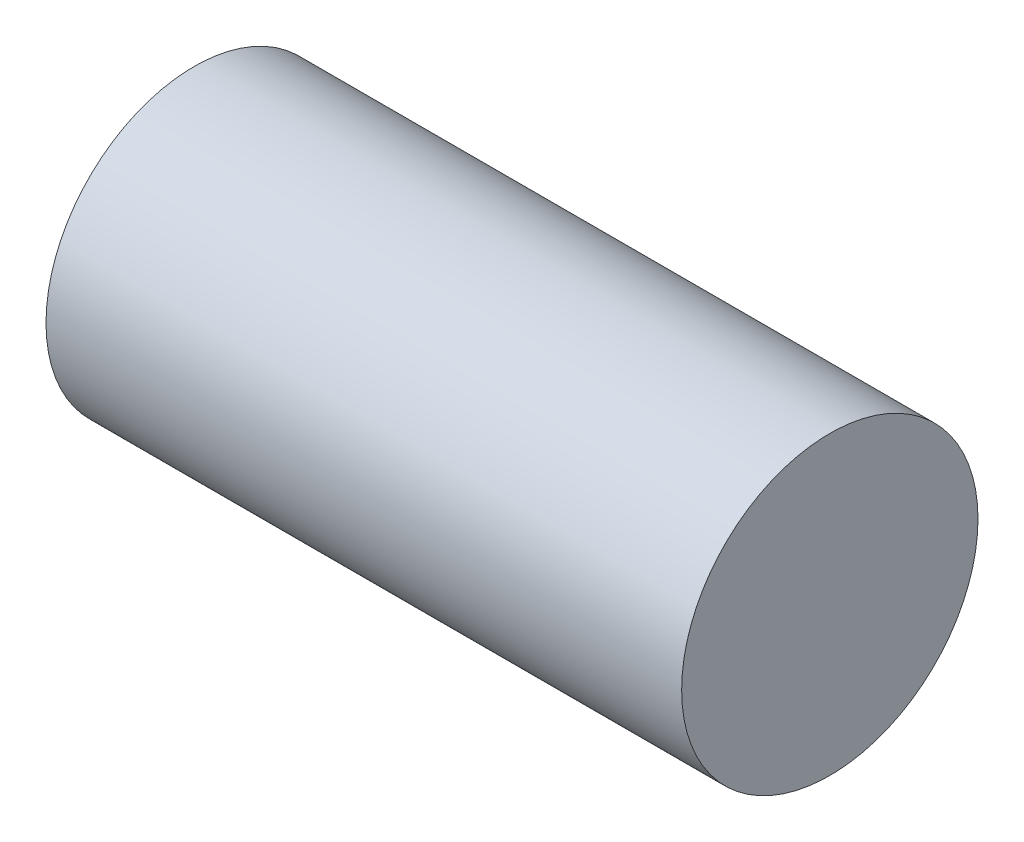
ISO-10303-21;
HEADER;
FILE_DESCRIPTION(('STEP AP214'),'2;1');
FILE_NAME('part.step','',(''),(''),'','','');
FILE_SCHEMA(('AUTOMOTIVE_DESIGN { 1 0 10303 214 1 1 1 1 }'));
ENDSEC;
DATA;
#1=APPLICATION_CONTEXT('core data for automotive mechanical design processes');
#2=APPLICATION_PROTOCOL_DEFINITION('international standard','automotive_design',2000,#1);
#3=PRODUCT_CONTEXT('',#1,'mechanical');
#4=PRODUCT('Part','Part','',(#3));
#5=PRODUCT_RELATED_PRODUCT_CATEGORY('part','',(#4));
#6=PRODUCT_DEFINITION_FORMATION('','',#4);
#7=PRODUCT_DEFINITION_CONTEXT('part definition',#1,'design');
#8=PRODUCT_DEFINITION('design','',#6,#7);
#9=PRODUCT_DEFINITION_SHAPE('','',#8);
#10=(LENGTH_UNIT() NAMED_UNIT(*) SI_UNIT(.MILLI.,.METRE.));
#11=(NAMED_UNIT(*) PLANE_ANGLE_UNIT() SI_UNIT($,.RADIAN.));
#12=(NAMED_UNIT(*) SI_UNIT($,.STERADIAN.) SOLID_ANGLE_UNIT());
#13=UNCERTAINTY_MEASURE_WITH_UNIT(LENGTH_MEASURE(1.E-05),#10,'distance_accuracy_value','');
#14=(GEOMETRIC_REPRESENTATION_CONTEXT(3) GLOBAL_UNCERTAINTY_ASSIGNED_CONTEXT((#13)) GLOBAL_UNIT_ASSIGNED_CONTEXT((#10,
#11,#12)) REPRESENTATION_CONTEXT('',''));
#15=CARTESIAN_POINT('',(0.,0.,0.));
#16=DIRECTION('',(0.,0.,1.));
#17=DIRECTION('',(1.,0.,0.));
#18=AXIS2_PLACEMENT_3D('',#15,#16,#17);
#19=CARTESIAN_POINT('',(16.9855,-9.313,-4.971));
#20=DIRECTION('',(-1.,0.,0.));
#21=DIRECTION('',(0.,0.,1.));
#22=AXIS2_PLACEMENT_3D('',#19,#20,#21);
#23=CYLINDRICAL_SURFACE('',#22,7.919);
#24=CARTESIAN_POINT('',(16.9855,-9.313,-4.971));
#25=DIRECTION('',(1.,0.,0.));
#26=DIRECTION('',(0.,0.,-1.));
#27=AXIS2_PLACEMENT_3D('',#24,#25,#26);
#28=CIRCLE('',#27,7.919);
#29=CARTESIAN_POINT('',(16.9855,-9.313,-12.89));
#30=VERTEX_POINT('',#29);
#31=EDGE_CURVE('E10',#30,#30,#28,.T.);
#32=ORIENTED_EDGE('',*,*,#31,.F.);
#33=EDGE_LOOP('',(#32));
#34=FACE_BOUND('',#33,.T.);
#35=CARTESIAN_POINT('',(-16.9855,-9.313,-4.971));
#36=DIRECTION('',(1.,0.,0.));
#37=DIRECTION('',(0.,0.,-1.));
#38=AXIS2_PLACEMENT_3D('',#35,#36,#37);
#39=CIRCLE('',#38,7.919);
#40=CARTESIAN_POINT('',(-16.9855,-9.313,-12.89));
#41=VERTEX_POINT('',#40);
#42=EDGE_CURVE('E45',#41,#41,#39,.T.);
#43=ORIENTED_EDGE('',*,*,#42,.T.);
#44=EDGE_LOOP('',(#43));
#45=FACE_BOUND('',#44,.T.);
#46=ADVANCED_FACE('F39',(#34,#45),#23,.T.);
#47=CARTESIAN_POINT('',(16.9855,-9.313,-4.971));
#48=DIRECTION('',(1.,0.,0.));
#49=DIRECTION('',(0.,0.,-1.));
#50=AXIS2_PLACEMENT_3D('',#47,#48,#49);
#51=PLANE('',#50);
#52=ORIENTED_EDGE('',*,*,#31,.T.);
#53=EDGE_LOOP('',(#52));
#54=FACE_BOUND('',#53,.T.);
#55=ADVANCED_FACE('F53',(#54),#51,.T.);
#56=CARTESIAN_POINT('',(-16.9855,-9.313,-4.971));
#57=DIRECTION('',(1.,0.,0.));
#58=DIRECTION('',(0.,0.,-1.));
#59=AXIS2_PLACEMENT_3D('',#56,#57,#58);
#60=PLANE('',#59);
#61=ORIENTED_EDGE('',*,*,#42,.F.);
#62=EDGE_LOOP('',(#61));
#63=FACE_BOUND('',#62,.T.);
#64=ADVANCED_FACE('F55',(#63),#60,.F.);
#65=CLOSED_SHELL('',(#46,#55,#64));
#66=MANIFOLD_SOLID_BREP('B2',#65);
#67=ADVANCED_BREP_SHAPE_REPRESENTATION('',(#18,#66),#14);
#68=SHAPE_DEFINITION_REPRESENTATION(#9,#67);
ENDSEC;
END-ISO-10303-21;
